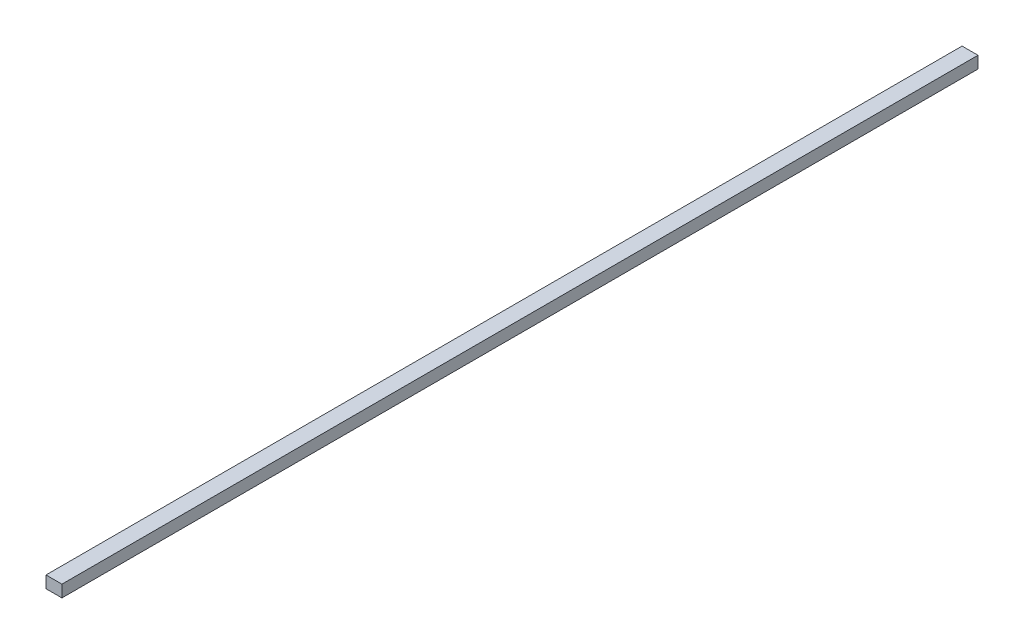
ISO-10303-21;
HEADER;
FILE_DESCRIPTION(('STEP AP214'),'2;1');
FILE_NAME('part.step','',(''),(''),'','','');
FILE_SCHEMA(('AUTOMOTIVE_DESIGN { 1 0 10303 214 1 1 1 1 }'));
ENDSEC;
DATA;
#1=APPLICATION_CONTEXT('core data for automotive mechanical design processes');
#2=APPLICATION_PROTOCOL_DEFINITION('international standard','automotive_design',2000,#1);
#3=PRODUCT_CONTEXT('',#1,'mechanical');
#4=PRODUCT('Part','Part','',(#3));
#5=PRODUCT_RELATED_PRODUCT_CATEGORY('part','',(#4));
#6=PRODUCT_DEFINITION_FORMATION('','',#4);
#7=PRODUCT_DEFINITION_CONTEXT('part definition',#1,'design');
#8=PRODUCT_DEFINITION('design','',#6,#7);
#9=PRODUCT_DEFINITION_SHAPE('','',#8);
#10=(LENGTH_UNIT() NAMED_UNIT(*) SI_UNIT(.MILLI.,.METRE.));
#11=(NAMED_UNIT(*) PLANE_ANGLE_UNIT() SI_UNIT($,.RADIAN.));
#12=(NAMED_UNIT(*) SI_UNIT($,.STERADIAN.) SOLID_ANGLE_UNIT());
#13=UNCERTAINTY_MEASURE_WITH_UNIT(LENGTH_MEASURE(1.E-05),#10,'distance_accuracy_value','');
#14=(GEOMETRIC_REPRESENTATION_CONTEXT(3) GLOBAL_UNCERTAINTY_ASSIGNED_CONTEXT((#13)) GLOBAL_UNIT_ASSIGNED_CONTEXT((#10,
#11,#12)) REPRESENTATION_CONTEXT('',''));
#15=CARTESIAN_POINT('',(0.,0.,0.));
#16=DIRECTION('',(0.,0.,1.));
#17=DIRECTION('',(1.,0.,0.));
#18=AXIS2_PLACEMENT_3D('',#15,#16,#17);
#19=CARTESIAN_POINT('',(-2.,3.,115.));
#20=DIRECTION('',(1.,0.,0.));
#21=DIRECTION('',(0.,0.,-1.));
#22=AXIS2_PLACEMENT_3D('',#19,#20,#21);
#23=PLANE('',#22);
#24=DIRECTION('',(0.,0.,1.));
#25=VECTOR('',#24,1.);
#26=CARTESIAN_POINT('',(-2.,0.,115.));
#27=LINE('',#26,#25);
#28=CARTESIAN_POINT('',(-2.,0.,-115.));
#29=VERTEX_POINT('',#28);
#30=CARTESIAN_POINT('',(-2.,0.,115.));
#31=VERTEX_POINT('',#30);
#32=EDGE_CURVE('E96',#29,#31,#27,.T.);
#33=ORIENTED_EDGE('',*,*,#32,.T.);
#34=DIRECTION('',(0.,-1.,0.));
#35=VECTOR('',#34,1.);
#36=CARTESIAN_POINT('',(-2.,3.,115.));
#37=LINE('',#36,#35);
#38=CARTESIAN_POINT('',(-2.,3.,115.));
#39=VERTEX_POINT('',#38);
#40=EDGE_CURVE('E11',#39,#31,#37,.T.);
#41=ORIENTED_EDGE('',*,*,#40,.F.);
#42=DIRECTION('',(0.,0.,1.));
#43=VECTOR('',#42,1.);
#44=CARTESIAN_POINT('',(-2.,3.,115.));
#45=LINE('',#44,#43);
#46=CARTESIAN_POINT('',(-2.,3.,-115.));
#47=VERTEX_POINT('',#46);
#48=EDGE_CURVE('E84',#47,#39,#45,.T.);
#49=ORIENTED_EDGE('',*,*,#48,.F.);
#50=DIRECTION('',(0.,-1.,0.));
#51=VECTOR('',#50,1.);
#52=CARTESIAN_POINT('',(-2.,3.,-115.));
#53=LINE('',#52,#51);
#54=EDGE_CURVE('E92',#47,#29,#53,.T.);
#55=ORIENTED_EDGE('',*,*,#54,.T.);
#56=EDGE_LOOP('',(#33,#41,#49,#55));
#57=FACE_BOUND('',#56,.T.);
#58=ADVANCED_FACE('F33',(#57),#23,.F.);
#59=CARTESIAN_POINT('',(2.,3.,115.));
#60=DIRECTION('',(0.,0.,-1.));
#61=DIRECTION('',(-1.,0.,0.));
#62=AXIS2_PLACEMENT_3D('',#59,#60,#61);
#63=PLANE('',#62);
#64=DIRECTION('',(1.,0.,0.));
#65=VECTOR('',#64,1.);
#66=CARTESIAN_POINT('',(2.,0.,115.));
#67=LINE('',#66,#65);
#68=CARTESIAN_POINT('',(2.,0.,115.));
#69=VERTEX_POINT('',#68);
#70=EDGE_CURVE('E88',#31,#69,#67,.T.);
#71=ORIENTED_EDGE('',*,*,#70,.T.);
#72=DIRECTION('',(0.,-1.,0.));
#73=VECTOR('',#72,1.);
#74=CARTESIAN_POINT('',(2.,3.,115.));
#75=LINE('',#74,#73);
#76=CARTESIAN_POINT('',(2.,3.,115.));
#77=VERTEX_POINT('',#76);
#78=EDGE_CURVE('E41',#77,#69,#75,.T.);
#79=ORIENTED_EDGE('',*,*,#78,.F.);
#80=DIRECTION('',(1.,0.,0.));
#81=VECTOR('',#80,1.);
#82=CARTESIAN_POINT('',(2.,3.,115.));
#83=LINE('',#82,#81);
#84=EDGE_CURVE('E79',#39,#77,#83,.T.);
#85=ORIENTED_EDGE('',*,*,#84,.F.);
#86=ORIENTED_EDGE('',*,*,#40,.T.);
#87=EDGE_LOOP('',(#71,#79,#85,#86));
#88=FACE_BOUND('',#87,.T.);
#89=ADVANCED_FACE('F87',(#88),#63,.F.);
#90=CARTESIAN_POINT('',(2.,3.,115.));
#91=DIRECTION('',(-1.,0.,0.));
#92=DIRECTION('',(0.,0.,1.));
#93=AXIS2_PLACEMENT_3D('',#90,#91,#92);
#94=PLANE('',#93);
#95=DIRECTION('',(0.,0.,-1.));
#96=VECTOR('',#95,1.);
#97=CARTESIAN_POINT('',(2.,0.,115.));
#98=LINE('',#97,#96);
#99=CARTESIAN_POINT('',(2.,0.,-115.));
#100=VERTEX_POINT('',#99);
#101=EDGE_CURVE('E66',#69,#100,#98,.T.);
#102=ORIENTED_EDGE('',*,*,#101,.T.);
#103=DIRECTION('',(0.,-1.,0.));
#104=VECTOR('',#103,1.);
#105=CARTESIAN_POINT('',(2.,3.,-115.));
#106=LINE('',#105,#104);
#107=CARTESIAN_POINT('',(2.,3.,-115.));
#108=VERTEX_POINT('',#107);
#109=EDGE_CURVE('E89',#108,#100,#106,.T.);
#110=ORIENTED_EDGE('',*,*,#109,.F.);
#111=DIRECTION('',(0.,0.,-1.));
#112=VECTOR('',#111,1.);
#113=CARTESIAN_POINT('',(2.,3.,115.));
#114=LINE('',#113,#112);
#115=EDGE_CURVE('E82',#77,#108,#114,.T.);
#116=ORIENTED_EDGE('',*,*,#115,.F.);
#117=ORIENTED_EDGE('',*,*,#78,.T.);
#118=EDGE_LOOP('',(#102,#110,#116,#117));
#119=FACE_BOUND('',#118,.T.);
#120=ADVANCED_FACE('F90',(#119),#94,.F.);
#121=CARTESIAN_POINT('',(2.,3.,-115.));
#122=DIRECTION('',(0.,0.,1.));
#123=DIRECTION('',(1.,0.,0.));
#124=AXIS2_PLACEMENT_3D('',#121,#122,#123);
#125=PLANE('',#124);
#126=DIRECTION('',(-1.,0.,0.));
#127=VECTOR('',#126,1.);
#128=CARTESIAN_POINT('',(2.,0.,-115.));
#129=LINE('',#128,#127);
#130=EDGE_CURVE('E72',#100,#29,#129,.T.);
#131=ORIENTED_EDGE('',*,*,#130,.T.);
#132=ORIENTED_EDGE('',*,*,#54,.F.);
#133=DIRECTION('',(-1.,0.,0.));
#134=VECTOR('',#133,1.);
#135=CARTESIAN_POINT('',(2.,3.,-115.));
#136=LINE('',#135,#134);
#137=EDGE_CURVE('E49',#108,#47,#136,.T.);
#138=ORIENTED_EDGE('',*,*,#137,.F.);
#139=ORIENTED_EDGE('',*,*,#109,.T.);
#140=EDGE_LOOP('',(#131,#132,#138,#139));
#141=FACE_BOUND('',#140,.T.);
#142=ADVANCED_FACE('F103',(#141),#125,.F.);
#143=CARTESIAN_POINT('',(0.,3.,0.));
#144=DIRECTION('',(0.,1.,0.));
#145=DIRECTION('',(0.,0.,1.));
#146=AXIS2_PLACEMENT_3D('',#143,#144,#145);
#147=PLANE('',#146);
#148=ORIENTED_EDGE('',*,*,#48,.T.);
#149=ORIENTED_EDGE('',*,*,#84,.T.);
#150=ORIENTED_EDGE('',*,*,#115,.T.);
#151=ORIENTED_EDGE('',*,*,#137,.T.);
#152=EDGE_LOOP('',(#148,#149,#150,#151));
#153=FACE_BOUND('',#152,.T.);
#154=ADVANCED_FACE('F80',(#153),#147,.T.);
#155=CARTESIAN_POINT('',(0.,0.,0.));
#156=DIRECTION('',(0.,1.,0.));
#157=DIRECTION('',(0.,0.,1.));
#158=AXIS2_PLACEMENT_3D('',#155,#156,#157);
#159=PLANE('',#158);
#160=ORIENTED_EDGE('',*,*,#32,.F.);
#161=ORIENTED_EDGE('',*,*,#130,.F.);
#162=ORIENTED_EDGE('',*,*,#101,.F.);
#163=ORIENTED_EDGE('',*,*,#70,.F.);
#164=EDGE_LOOP('',(#160,#161,#162,#163));
#165=FACE_BOUND('',#164,.T.);
#166=ADVANCED_FACE('F106',(#165),#159,.F.);
#167=CLOSED_SHELL('',(#58,#89,#120,#142,#154,#166));
#168=MANIFOLD_SOLID_BREP('B2',#167);
#169=ADVANCED_BREP_SHAPE_REPRESENTATION('',(#18,#168),#14);
#170=SHAPE_DEFINITION_REPRESENTATION(#9,#169);
ENDSEC;
END-ISO-10303-21;
